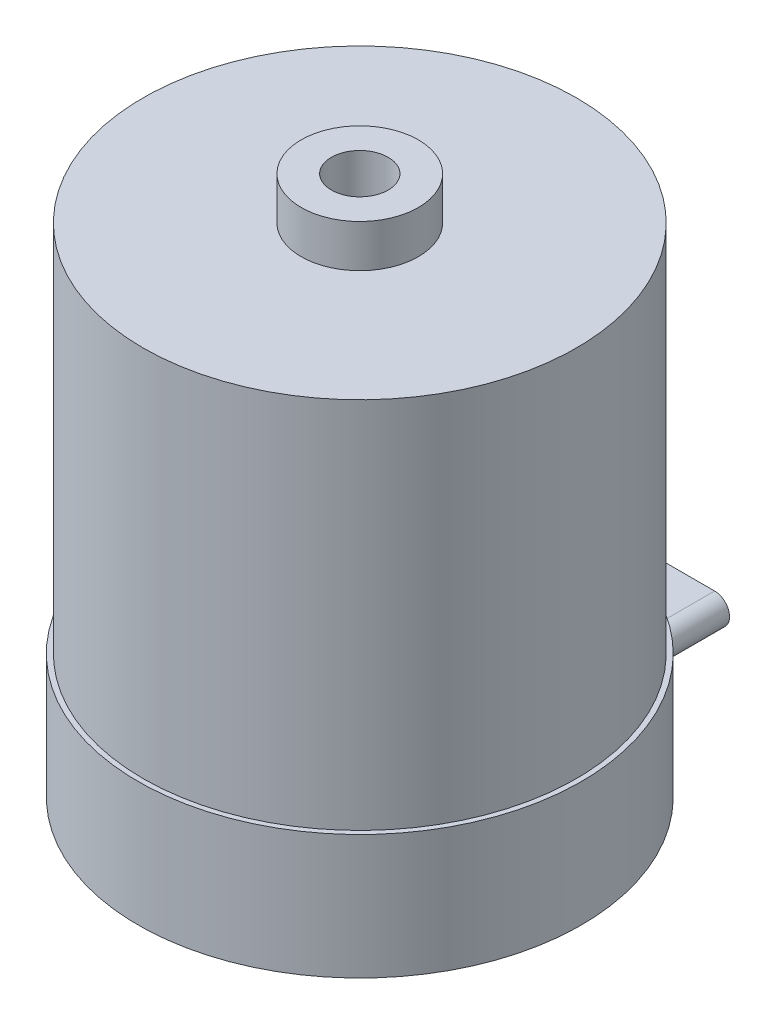
ISO-10303-21;
HEADER;
FILE_DESCRIPTION(('STEP AP214'),'2;1');
FILE_NAME('part.step','',(''),(''),'','','');
FILE_SCHEMA(('AUTOMOTIVE_DESIGN { 1 0 10303 214 1 1 1 1 }'));
ENDSEC;
DATA;
#1=APPLICATION_CONTEXT('core data for automotive mechanical design processes');
#2=APPLICATION_PROTOCOL_DEFINITION('international standard','automotive_design',2000,#1);
#3=PRODUCT_CONTEXT('',#1,'mechanical');
#4=PRODUCT('Part','Part','',(#3));
#5=PRODUCT_RELATED_PRODUCT_CATEGORY('part','',(#4));
#6=PRODUCT_DEFINITION_FORMATION('','',#4);
#7=PRODUCT_DEFINITION_CONTEXT('part definition',#1,'design');
#8=PRODUCT_DEFINITION('design','',#6,#7);
#9=PRODUCT_DEFINITION_SHAPE('','',#8);
#10=(LENGTH_UNIT() NAMED_UNIT(*) SI_UNIT(.MILLI.,.METRE.));
#11=(NAMED_UNIT(*) PLANE_ANGLE_UNIT() SI_UNIT($,.RADIAN.));
#12=(NAMED_UNIT(*) SI_UNIT($,.STERADIAN.) SOLID_ANGLE_UNIT());
#13=UNCERTAINTY_MEASURE_WITH_UNIT(LENGTH_MEASURE(1.E-05),#10,'distance_accuracy_value','');
#14=(GEOMETRIC_REPRESENTATION_CONTEXT(3) GLOBAL_UNCERTAINTY_ASSIGNED_CONTEXT((#13)) GLOBAL_UNIT_ASSIGNED_CONTEXT((#10,
#11,#12)) REPRESENTATION_CONTEXT('',''));
#15=CARTESIAN_POINT('',(0.,0.,0.));
#16=DIRECTION('',(0.,0.,1.));
#17=DIRECTION('',(1.,0.,0.));
#18=AXIS2_PLACEMENT_3D('',#15,#16,#17);
#19=CARTESIAN_POINT('',(0.,0.,0.));
#20=DIRECTION('',(0.,-1.,0.));
#21=DIRECTION('',(0.,0.,-1.));
#22=AXIS2_PLACEMENT_3D('',#19,#20,#21);
#23=CYLINDRICAL_SURFACE('',#22,31.2);
#24=CARTESIAN_POINT('',(0.,17.5,0.));
#25=DIRECTION('',(0.,-1.,0.));
#26=DIRECTION('',(0.,0.,-1.));
#27=AXIS2_PLACEMENT_3D('',#24,#25,#26);
#28=CIRCLE('',#27,31.2);
#29=CARTESIAN_POINT('',(0.,17.5,-31.2));
#30=VERTEX_POINT('',#29);
#31=EDGE_CURVE('E134',#30,#30,#28,.T.);
#32=ORIENTED_EDGE('',*,*,#31,.T.);
#33=EDGE_LOOP('',(#32));
#34=FACE_BOUND('',#33,.T.);
#35=CARTESIAN_POINT('',(0.,0.,0.));
#36=DIRECTION('',(0.,-1.,0.));
#37=DIRECTION('',(0.,0.,-1.));
#38=AXIS2_PLACEMENT_3D('',#35,#36,#37);
#39=CIRCLE('',#38,31.2);
#40=CARTESIAN_POINT('',(0.,0.,-31.2));
#41=VERTEX_POINT('',#40);
#42=EDGE_CURVE('E131',#41,#41,#39,.T.);
#43=ORIENTED_EDGE('',*,*,#42,.F.);
#44=EDGE_LOOP('',(#43));
#45=FACE_BOUND('',#44,.T.);
#46=CARTESIAN_POINT('',(0.,1.70000000000001,0.));
#47=DIRECTION('',(0.,1.,0.));
#48=DIRECTION('',(0.,0.,1.));
#49=AXIS2_PLACEMENT_3D('',#46,#47,#48);
#50=CIRCLE('',#49,31.2);
#51=CARTESIAN_POINT('',(-5.75,1.70000000000001,-30.6655751617347));
#52=VERTEX_POINT('',#51);
#53=CARTESIAN_POINT('',(5.75,1.70000000000001,-30.6655751617347));
#54=VERTEX_POINT('',#53);
#55=EDGE_CURVE('E46',#52,#54,#50,.F.);
#56=ORIENTED_EDGE('',*,*,#55,.T.);
#57=CARTESIAN_POINT('',(7.85,3.80000000000001,-30.196316000466));
#58=CARTESIAN_POINT('',(7.84999448567099,3.91536173694016,-30.1963180338355));
#59=CARTESIAN_POINT('',(7.84045705514602,4.03080569584893,-30.1988018225664));
#60=CARTESIAN_POINT('',(7.80260075470967,4.25844900335472,-30.2086045321478));
#61=CARTESIAN_POINT('',(7.77425978636606,4.37064437201333,-30.2159291420244));
#62=CARTESIAN_POINT('',(7.69977962837956,4.58840336895946,-30.2349939627344));
#63=CARTESIAN_POINT('',(7.65366296014359,4.69397519311462,-30.2467285857132));
#64=CARTESIAN_POINT('',(7.54510346408682,4.89578030384347,-30.2739910001233));
#65=CARTESIAN_POINT('',(7.48266312870166,4.99201501301372,-30.2895182124464));
#66=CARTESIAN_POINT('',(7.34217536677713,5.17419860983827,-30.3238810028875));
#67=CARTESIAN_POINT('',(7.26389187741454,5.25995599132187,-30.3427660220163));
#68=CARTESIAN_POINT('',(7.09461055366295,5.41721216353872,-30.3827920893837));
#69=CARTESIAN_POINT('',(7.00361055829085,5.48870852579844,-30.4039335209219));
#70=CARTESIAN_POINT('',(6.80861687420779,5.61751663663373,-30.448201858506));
#71=CARTESIAN_POINT('',(6.70432723911564,5.6743671237312,-30.4713681325078));
#72=CARTESIAN_POINT('',(6.48776637157115,5.76969572869092,-30.5182102081133));
#73=CARTESIAN_POINT('',(6.3754942917679,5.80817189273031,-30.5418860636235));
#74=CARTESIAN_POINT('',(6.14414344976607,5.86617989005516,-30.5892735361144));
#75=CARTESIAN_POINT('',(6.0249839120328,5.88539490606039,-30.6129795254055));
#76=CARTESIAN_POINT('',(5.78491144916794,5.90315673683179,-30.659252126115));
#77=CARTESIAN_POINT('',(5.66399852801267,5.90170359846171,-30.6818187401168));
#78=CARTESIAN_POINT('',(5.42418977674542,5.87805850289925,-30.725119631691));
#79=CARTESIAN_POINT('',(5.30528967781312,5.85591813480076,-30.7458583269266));
#80=CARTESIAN_POINT('',(5.07270599755781,5.79143980538671,-30.785086780092));
#81=CARTESIAN_POINT('',(4.95902204839848,5.74910327068646,-30.803576696755));
#82=CARTESIAN_POINT('',(4.74183165765481,5.64603511807777,-30.8377522899945));
#83=CARTESIAN_POINT('',(4.63820619717257,5.58556602456791,-30.8534732153294));
#84=CARTESIAN_POINT('',(4.44251472246486,5.44766696079992,-30.882257991054));
#85=CARTESIAN_POINT('',(4.35044781448615,5.370238303195,-30.895322046932));
#86=CARTESIAN_POINT('',(4.18189633791714,5.20180166203175,-30.9185849979683));
#87=CARTESIAN_POINT('',(4.1052111971908,5.11099952776402,-30.928821534101));
#88=CARTESIAN_POINT('',(3.9681434569102,4.91760123679714,-30.9467062991593));
#89=CARTESIAN_POINT('',(3.90776005340582,4.81500566206909,-30.9543546557303));
#90=CARTESIAN_POINT('',(3.80557366063833,4.60190365890878,-30.967083336165));
#91=CARTESIAN_POINT('',(3.76361353374799,4.49147385269025,-30.972185431127));
#92=CARTESIAN_POINT('',(3.69876250995189,4.26506961279569,-30.97999728912));
#93=CARTESIAN_POINT('',(3.67587116041637,4.14909531079675,-30.9827071089357));
#94=CARTESIAN_POINT('',(3.64988901256904,3.91536357715394,-30.9857787356151));
#95=CARTESIAN_POINT('',(3.64672388373901,3.79761451729509,-30.9861493568973));
#96=CARTESIAN_POINT('',(3.66008913640882,3.56325591112079,-30.9845734362905));
#97=CARTESIAN_POINT('',(3.67661932423248,3.44664635361128,-30.9826269171875));
#98=CARTESIAN_POINT('',(3.72886425587058,3.21797388602611,-30.9763822175439));
#99=CARTESIAN_POINT('',(3.76456337416923,3.1059073526222,-30.9720859523414));
#100=CARTESIAN_POINT('',(3.85407986974006,2.88939026626509,-30.9610737857281));
#101=CARTESIAN_POINT('',(3.907897198427,2.78493969289009,-30.9543578908057));
#102=CARTESIAN_POINT('',(4.03214871327865,2.58644483624029,-30.9384177044427));
#103=CARTESIAN_POINT('',(4.10260662660912,2.49241569639485,-30.9291898283718));
#104=CARTESIAN_POINT('',(4.25801439415385,2.3175485287904,-30.9081776459965));
#105=CARTESIAN_POINT('',(4.34296442100071,2.23671065819054,-30.8963933092387));
#106=CARTESIAN_POINT('',(4.52530271953543,2.09006731028194,-30.8702144813501));
#107=CARTESIAN_POINT('',(4.62274868880571,2.02433578467045,-30.8558077434616));
#108=CARTESIAN_POINT('',(4.82691310032025,1.91013380061104,-30.824528605131));
#109=CARTESIAN_POINT('',(4.93363192581169,1.86166405601508,-30.8076561027592));
#110=CARTESIAN_POINT('',(5.15439459205106,1.78279145016711,-30.771493956157));
#111=CARTESIAN_POINT('',(5.26850107226489,1.75257432921548,-30.7521818032359));
#112=CARTESIAN_POINT('',(5.4998297392923,1.71164760622557,-30.7116535109819));
#113=CARTESIAN_POINT('',(5.61705218211438,1.70093961212095,-30.6904372148616));
#114=CARTESIAN_POINT('',(5.85309745810511,1.69916611984691,-30.6463027552087));
#115=CARTESIAN_POINT('',(5.97191866608608,1.70838972569792,-30.6233642646505));
#116=CARTESIAN_POINT('',(6.2061671661192,1.74670984066246,-30.5767519563617));
#117=CARTESIAN_POINT('',(6.32159414578783,1.7758081729877,-30.5530780713598));
#118=CARTESIAN_POINT('',(6.54731732005256,1.85353903658137,-30.5055095302243));
#119=CARTESIAN_POINT('',(6.65753105894077,1.90241186796311,-30.4816158267315));
#120=CARTESIAN_POINT('',(6.86815888505296,2.01837894379973,-30.4348492015636));
#121=CARTESIAN_POINT('',(6.96857299693946,2.0854731423957,-30.4119762773195));
#122=CARTESIAN_POINT('',(7.15661724235671,2.23605522889835,-30.3682754553209));
#123=CARTESIAN_POINT('',(7.24425904270944,2.31952799020775,-30.3474456970036));
#124=CARTESIAN_POINT('',(7.4042172388432,2.50070635366892,-30.3088164911236));
#125=CARTESIAN_POINT('',(7.47653146443507,2.59841396799419,-30.2910174727451));
#126=CARTESIAN_POINT('',(7.60221095766867,2.80326666350593,-30.2597176840339));
#127=CARTESIAN_POINT('',(7.65592006845196,2.9101890506906,-30.2461394557056));
#128=CARTESIAN_POINT('',(7.74446528875276,3.13192964509071,-30.2235895908274));
#129=CARTESIAN_POINT('',(7.77932829058574,3.246736336612,-30.2146113912613));
#130=CARTESIAN_POINT('',(7.81939164445559,3.43531736623654,-30.2042603280688));
#131=CARTESIAN_POINT('',(7.83085237751968,3.50773452320987,-30.2012882843468));
#132=CARTESIAN_POINT('',(7.84615823177772,3.65342339830405,-30.1973154940548));
#133=CARTESIAN_POINT('',(7.85000350399839,3.72669509944893,-30.1963147083916));
#134=CARTESIAN_POINT('',(7.85,3.80000000000001,-30.196316000466));
#135=B_SPLINE_CURVE_WITH_KNOTS('',3,(#57,#58,#59,#60,#61,#62,#63,#64,#65,#66,#67,#68,#69,#70,
#71,#72,#73,#74,#75,#76,#77,#78,#79,#80,#81,#82,#83,#84,#85,#86,#87,#88,#89,#90,#91,#92,#93,#94,
#95,#96,#97,#98,#99,#100,#101,#102,#103,#104,#105,#106,#107,#108,#109,#110,#111,#112,#113,#114,
#115,#116,#117,#118,#119,#120,#121,#122,#123,#124,#125,#126,#127,#128,#129,#130,#131,#132,#133,
#134),.UNSPECIFIED.,.T.,.F.,(4,2,2,2,2,2,2,2,2,2,2,2,2,2,2,2,2,2,2,2,2,2,2,2,2,2,2,2,2,2,2,2,2,
2,2,2,2,2,4),(0.,0.345812604516335,0.692032339057707,1.03781485533047,1.38354460540801,
1.73486537460997,2.08624591837429,2.44762015614668,2.80903281188506,3.17629715637301,
3.54356066811214,3.90991074834488,4.27623495419899,4.63749247062641,4.99872203595947,
5.35488148157523,5.71102335932368,6.06406561536621,6.41709949111361,6.76880228899005,
7.12050162838481,7.47191471500951,7.82332685930335,8.17524312627262,8.52716358562311,
8.88077178731507,9.2343946105926,9.59155783220817,9.948750489728,10.3111588950779,
10.6736005504962,11.0405856248631,11.407569775623,11.7742165761485,12.14091525456,
12.5004215457531,12.8594134788147,13.0791593147986,13.298900792829),.UNSPECIFIED.);
#136=CARTESIAN_POINT('',(5.75,5.90000000000001,-30.6655751617347));
#137=VERTEX_POINT('',#136);
#138=EDGE_CURVE('E11',#54,#137,#135,.T.);
#139=ORIENTED_EDGE('',*,*,#138,.T.);
#140=CARTESIAN_POINT('',(0.,5.90000000000001,0.));
#141=DIRECTION('',(0.,-1.,0.));
#142=DIRECTION('',(0.,0.,-1.));
#143=AXIS2_PLACEMENT_3D('',#140,#141,#142);
#144=CIRCLE('',#143,31.2);
#145=CARTESIAN_POINT('',(-5.75,5.90000000000001,-30.6655751617347));
#146=VERTEX_POINT('',#145);
#147=EDGE_CURVE('E149',#137,#146,#144,.F.);
#148=ORIENTED_EDGE('',*,*,#147,.T.);
#149=CARTESIAN_POINT('',(-3.65,3.80000000000001,-30.9857628597393));
#150=CARTESIAN_POINT('',(-3.65000518949174,3.91726017505812,-30.9857628413295));
#151=CARTESIAN_POINT('',(-3.65985506936407,4.034602285374,-30.9846068929721));
#152=CARTESIAN_POINT('',(-3.69899858939728,4.26604529547181,-30.9799577623603));
#153=CARTESIAN_POINT('',(-3.72831474626438,4.38014228204068,-30.9764618734515));
#154=CARTESIAN_POINT('',(-3.8055168836236,4.60170737347846,-30.9670719374449));
#155=CARTESIAN_POINT('',(-3.85339290305004,4.70917899837475,-30.9611791766634));
#156=CARTESIAN_POINT('',(-3.96628465706012,4.91448765848241,-30.9469191858784));
#157=CARTESIAN_POINT('',(-4.03129627141931,5.01232700200217,-30.938552550655));
#158=CARTESIAN_POINT('',(-4.17668015868915,5.19584877055479,-30.9192612070236));
#159=CARTESIAN_POINT('',(-4.25708112199871,5.28150795986229,-30.9083317119658));
#160=CARTESIAN_POINT('',(-4.4307960040096,5.43810178203847,-30.8839072105468));
#161=CARTESIAN_POINT('',(-4.52411064458767,5.50903559120135,-30.8704120607491));
#162=CARTESIAN_POINT('',(-4.721556602517,5.63468905693462,-30.840831949992));
#163=CARTESIAN_POINT('',(-4.82575270580956,5.68930313729561,-30.8247311223569));
#164=CARTESIAN_POINT('',(-5.0414504513543,5.78031886883586,-30.7901883522085));
#165=CARTESIAN_POINT('',(-5.1529524875179,5.81671953709362,-30.771746283413));
#166=CARTESIAN_POINT('',(-5.38146302838998,5.87077951568477,-30.7326120286708));
#167=CARTESIAN_POINT('',(-5.49852112433652,5.8882116501226,-30.711895770429));
#168=CARTESIAN_POINT('',(-5.73361381409757,5.90323777811276,-30.6688760129673));
#169=CARTESIAN_POINT('',(-5.85164849194836,5.90083004630019,-30.646572375869));
#170=CARTESIAN_POINT('',(-6.08722738959134,5.87617737983721,-30.60065813994));
#171=CARTESIAN_POINT('',(-6.20473774682522,5.85363568448239,-30.577032963254));
#172=CARTESIAN_POINT('',(-6.43420863124702,5.78898736847904,-30.5295708898073));
#173=CARTESIAN_POINT('',(-6.54616869771029,5.74687912662861,-30.5057339756636));
#174=CARTESIAN_POINT('',(-6.76246542252823,5.64374665843538,-30.4585199695313));
#175=CARTESIAN_POINT('',(-6.86672088466987,5.5825490072551,-30.4351492728353));
#176=CARTESIAN_POINT('',(-7.06344959612681,5.44298327755614,-30.3900950783371));
#177=CARTESIAN_POINT('',(-7.15592292929556,5.3646153212494,-30.3684115685278));
#178=CARTESIAN_POINT('',(-7.32570504770469,5.19340688526948,-30.3279017567364));
#179=CARTESIAN_POINT('',(-7.40311805616859,5.10067448124677,-30.3090560377859));
#180=CARTESIAN_POINT('',(-7.54115567981103,4.9028600896495,-30.27500690384));
#181=CARTESIAN_POINT('',(-7.60178281117327,4.79777995635274,-30.2598029429954));
#182=CARTESIAN_POINT('',(-7.70291978238377,4.5810531879501,-30.2342139475761));
#183=CARTESIAN_POINT('',(-7.74389661014344,4.46963773977319,-30.2237174796867));
#184=CARTESIAN_POINT('',(-7.80654793168506,4.24117233224939,-30.2075962126928));
#185=CARTESIAN_POINT('',(-7.82822605111029,4.12412343561425,-30.2019704985265));
#186=CARTESIAN_POINT('',(-7.85119265856595,3.89117127789702,-30.1960081850176));
#187=CARTESIAN_POINT('',(-7.85302537455721,3.77532500447955,-30.195530413542));
#188=CARTESIAN_POINT('',(-7.83765233358795,3.54499598885895,-30.1995242937609));
#189=CARTESIAN_POINT('',(-7.82044794540752,3.43051314922221,-30.2039955896141));
#190=CARTESIAN_POINT('',(-7.76782560394326,3.20718732661724,-30.2175711560321));
#191=CARTESIAN_POINT('',(-7.73257017051161,3.09830340095166,-30.2266340790688));
#192=CARTESIAN_POINT('',(-7.645075421259,2.88804711263119,-30.2488817605759));
#193=CARTESIAN_POINT('',(-7.59283495618144,2.78667525883499,-30.2620667979582));
#194=CARTESIAN_POINT('',(-7.47197946017543,2.5924912044058,-30.2921350970667));
#195=CARTESIAN_POINT('',(-7.40311159638771,2.49984530372517,-30.3090750937677));
#196=CARTESIAN_POINT('',(-7.25149240078806,2.3273449980673,-30.3457069245464));
#197=CARTESIAN_POINT('',(-7.16873905459701,2.24749245232366,-30.3653991578241));
#198=CARTESIAN_POINT('',(-6.98908128922251,2.10043103438709,-30.4072602288551));
#199=CARTESIAN_POINT('',(-6.8918393586395,2.0336499646173,-30.4294838587832));
#200=CARTESIAN_POINT('',(-6.68775648488291,1.91733905586522,-30.474987050394));
#201=CARTESIAN_POINT('',(-6.58091433030093,1.86781139786853,-30.4982667451525));
#202=CARTESIAN_POINT('',(-6.35813641306215,1.78641376012754,-30.5454960074716));
#203=CARTESIAN_POINT('',(-6.24205519675526,1.7549433745828,-30.5694492649659));
#204=CARTESIAN_POINT('',(-6.00609165145505,1.71222753463535,-30.6166839580516));
#205=CARTESIAN_POINT('',(-5.88620919015455,1.70098278499979,-30.6399653702046));
#206=CARTESIAN_POINT('',(-5.64565575804924,1.6991380807993,-30.6852014940704));
#207=CARTESIAN_POINT('',(-5.52498350188116,1.70859980638469,-30.7071520413068));
#208=CARTESIAN_POINT('',(-5.28671815199543,1.74818340142675,-30.7490690217212));
#209=CARTESIAN_POINT('',(-5.16912488775579,1.77830412421515,-30.7690355649501));
#210=CARTESIAN_POINT('',(-4.94186350021669,1.85802980725293,-30.8063484396295));
#211=CARTESIAN_POINT('',(-4.83211932108119,1.90740490094615,-30.8237224570727));
#212=CARTESIAN_POINT('',(-4.62238678510591,2.02435918361674,-30.8558715290639));
#213=CARTESIAN_POINT('',(-4.52239727320891,2.09193621371695,-30.8706468914872));
#214=CARTESIAN_POINT('',(-4.33664935546115,2.24227621181338,-30.8972840617516));
#215=CARTESIAN_POINT('',(-4.25069984097951,2.32479597180143,-30.909186279178));
#216=CARTESIAN_POINT('',(-4.09382374670733,2.503387185357,-30.9303554890465));
#217=CARTESIAN_POINT('',(-4.02289991154391,2.59946110943103,-30.9396220001498));
#218=CARTESIAN_POINT('',(-3.89889203251165,2.80135077282014,-30.9554926092961));
#219=CARTESIAN_POINT('',(-3.84563608923547,2.90705906459501,-30.9621224944043));
#220=CARTESIAN_POINT('',(-3.7576347811549,3.12593674000036,-30.9729263240446));
#221=CARTESIAN_POINT('',(-3.72286727701098,3.23909701670151,-30.9771032066008));
#222=CARTESIAN_POINT('',(-3.68194845607839,3.42746711324165,-30.9819865983437));
#223=CARTESIAN_POINT('',(-3.66998372443978,3.50144744300406,-30.9834033816469));
#224=CARTESIAN_POINT('',(-3.65400784924822,3.65027404605433,-30.9852915170586));
#225=CARTESIAN_POINT('',(-3.64999668610852,3.72512031720923,-30.9857628714954));
#226=CARTESIAN_POINT('',(-3.65,3.80000000000001,-30.9857628597393));
#227=B_SPLINE_CURVE_WITH_KNOTS('',3,(#149,#150,#151,#152,#153,#154,#155,#156,#157,#158,#159,
#160,#161,#162,#163,#164,#165,#166,#167,#168,#169,#170,#171,#172,#173,#174,#175,#176,#177,#178,
#179,#180,#181,#182,#183,#184,#185,#186,#187,#188,#189,#190,#191,#192,#193,#194,#195,#196,#197,
#198,#199,#200,#201,#202,#203,#204,#205,#206,#207,#208,#209,#210,#211,#212,#213,#214,#215,#216,
#217,#218,#219,#220,#221,#222,#223,#224,#225,#226),.UNSPECIFIED.,.T.,.F.,(4,2,2,2,2,2,2,2,2,2,2,
2,2,2,2,2,2,2,2,2,2,2,2,2,2,2,2,2,2,2,2,2,2,2,2,2,2,2,4),(0.,0.351507028935626,
0.703421357128441,1.05514707403931,1.40678829613248,1.75909158396814,2.11141457357805,
2.46596979328996,2.82054414518714,3.1793198293238,3.53812671455325,3.9023110630163,
4.26652559164762,4.63415037997652,5.00177255177207,5.3667523004482,5.73167730942241,
6.08743757949464,6.44313099886447,6.78904456907343,7.13493326948932,7.47776118532204,
7.82061230271677,8.16904738821365,8.51753306526655,8.87600318906776,9.23451861027051,
9.6006888243354,9.96687179744218,10.3341470354412,10.7014018896442,11.0644002931228,
11.4273556613925,11.7848621847183,12.1424339548582,12.4964170736696,12.8499753485394,
13.0744403012061,13.2989047010962),.UNSPECIFIED.);
#228=EDGE_CURVE('E152',#146,#52,#227,.T.);
#229=ORIENTED_EDGE('',*,*,#228,.T.);
#230=EDGE_LOOP('',(#56,#139,#148,#229));
#231=FACE_BOUND('',#230,.T.);
#232=ADVANCED_FACE('F33',(#34,#45,#231),#23,.T.);
#233=CARTESIAN_POINT('',(4.,76.,0.));
#234=DIRECTION('',(0.,1.,0.));
#235=DIRECTION('',(0.,0.,1.));
#236=AXIS2_PLACEMENT_3D('',#233,#234,#235);
#237=PLANE('',#236);
#238=CARTESIAN_POINT('',(0.,76.,0.));
#239=DIRECTION('',(0.,-1.,0.));
#240=DIRECTION('',(0.,0.,-1.));
#241=AXIS2_PLACEMENT_3D('',#238,#239,#240);
#242=CIRCLE('',#241,4.);
#243=CARTESIAN_POINT('',(0.,76.,-4.));
#244=VERTEX_POINT('',#243);
#245=EDGE_CURVE('E123',#244,#244,#242,.T.);
#246=ORIENTED_EDGE('',*,*,#245,.T.);
#247=EDGE_LOOP('',(#246));
#248=FACE_BOUND('',#247,.T.);
#249=CARTESIAN_POINT('',(0.,76.,0.));
#250=DIRECTION('',(0.,-1.,0.));
#251=DIRECTION('',(0.,0.,-1.));
#252=AXIS2_PLACEMENT_3D('',#249,#250,#251);
#253=CIRCLE('',#252,8.25);
#254=CARTESIAN_POINT('',(0.,76.,-8.25));
#255=VERTEX_POINT('',#254);
#256=EDGE_CURVE('E146',#255,#255,#253,.T.);
#257=ORIENTED_EDGE('',*,*,#256,.F.);
#258=EDGE_LOOP('',(#257));
#259=FACE_BOUND('',#258,.T.);
#260=ADVANCED_FACE('F35',(#248,#259),#237,.T.);
#261=CARTESIAN_POINT('',(0.,0.,0.));
#262=DIRECTION('',(0.,-1.,0.));
#263=DIRECTION('',(0.,0.,-1.));
#264=AXIS2_PLACEMENT_3D('',#261,#262,#263);
#265=CYLINDRICAL_SURFACE('',#264,8.25);
#266=ORIENTED_EDGE('',*,*,#256,.T.);
#267=EDGE_LOOP('',(#266));
#268=FACE_BOUND('',#267,.T.);
#269=CARTESIAN_POINT('',(0.,70.,0.));
#270=DIRECTION('',(0.,-1.,0.));
#271=DIRECTION('',(0.,0.,-1.));
#272=AXIS2_PLACEMENT_3D('',#269,#270,#271);
#273=CIRCLE('',#272,8.25);
#274=CARTESIAN_POINT('',(0.,70.,-8.25));
#275=VERTEX_POINT('',#274);
#276=EDGE_CURVE('E143',#275,#275,#273,.T.);
#277=ORIENTED_EDGE('',*,*,#276,.F.);
#278=EDGE_LOOP('',(#277));
#279=FACE_BOUND('',#278,.T.);
#280=ADVANCED_FACE('F224',(#268,#279),#265,.T.);
#281=CARTESIAN_POINT('',(8.25,70.,0.));
#282=DIRECTION('',(0.,1.,0.));
#283=DIRECTION('',(0.,0.,1.));
#284=AXIS2_PLACEMENT_3D('',#281,#282,#283);
#285=PLANE('',#284);
#286=ORIENTED_EDGE('',*,*,#276,.T.);
#287=EDGE_LOOP('',(#286));
#288=FACE_BOUND('',#287,.T.);
#289=CARTESIAN_POINT('',(0.,70.,0.));
#290=DIRECTION('',(0.,-1.,0.));
#291=DIRECTION('',(0.,0.,-1.));
#292=AXIS2_PLACEMENT_3D('',#289,#290,#291);
#293=CIRCLE('',#292,30.5);
#294=CARTESIAN_POINT('',(0.,70.,-30.5));
#295=VERTEX_POINT('',#294);
#296=EDGE_CURVE('E140',#295,#295,#293,.T.);
#297=ORIENTED_EDGE('',*,*,#296,.F.);
#298=EDGE_LOOP('',(#297));
#299=FACE_BOUND('',#298,.T.);
#300=ADVANCED_FACE('F339',(#288,#299),#285,.T.);
#301=CARTESIAN_POINT('',(0.,0.,0.));
#302=DIRECTION('',(0.,-1.,0.));
#303=DIRECTION('',(0.,0.,-1.));
#304=AXIS2_PLACEMENT_3D('',#301,#302,#303);
#305=CYLINDRICAL_SURFACE('',#304,30.5);
#306=ORIENTED_EDGE('',*,*,#296,.T.);
#307=EDGE_LOOP('',(#306));
#308=FACE_BOUND('',#307,.T.);
#309=CARTESIAN_POINT('',(0.,17.5,0.));
#310=DIRECTION('',(0.,-1.,0.));
#311=DIRECTION('',(0.,0.,-1.));
#312=AXIS2_PLACEMENT_3D('',#309,#310,#311);
#313=CIRCLE('',#312,30.5);
#314=CARTESIAN_POINT('',(0.,17.5,-30.5));
#315=VERTEX_POINT('',#314);
#316=EDGE_CURVE('E137',#315,#315,#313,.T.);
#317=ORIENTED_EDGE('',*,*,#316,.F.);
#318=EDGE_LOOP('',(#317));
#319=FACE_BOUND('',#318,.T.);
#320=ADVANCED_FACE('F215',(#308,#319),#305,.T.);
#321=CARTESIAN_POINT('',(30.5,17.5,0.));
#322=DIRECTION('',(0.,1.,0.));
#323=DIRECTION('',(0.,0.,1.));
#324=AXIS2_PLACEMENT_3D('',#321,#322,#323);
#325=PLANE('',#324);
#326=ORIENTED_EDGE('',*,*,#316,.T.);
#327=EDGE_LOOP('',(#326));
#328=FACE_BOUND('',#327,.T.);
#329=ORIENTED_EDGE('',*,*,#31,.F.);
#330=EDGE_LOOP('',(#329));
#331=FACE_BOUND('',#330,.T.);
#332=ADVANCED_FACE('F210',(#328,#331),#325,.T.);
#333=CARTESIAN_POINT('',(31.2,0.,0.));
#334=DIRECTION('',(0.,-1.,0.));
#335=DIRECTION('',(0.,0.,-1.));
#336=AXIS2_PLACEMENT_3D('',#333,#334,#335);
#337=PLANE('',#336);
#338=CARTESIAN_POINT('',(15.556349186104,0.,15.556349186104));
#339=DIRECTION('',(0.,-1.,0.));
#340=DIRECTION('',(0.,0.,-1.));
#341=AXIS2_PLACEMENT_3D('',#338,#339,#340);
#342=CIRCLE('',#341,1.65);
#343=CARTESIAN_POINT('',(15.556349186104,0.,13.906349186104));
#344=VERTEX_POINT('',#343);
#345=EDGE_CURVE('E97',#344,#344,#342,.T.);
#346=ORIENTED_EDGE('',*,*,#345,.F.);
#347=EDGE_LOOP('',(#346));
#348=FACE_BOUND('',#347,.T.);
#349=CARTESIAN_POINT('',(-15.5563491861041,0.,15.556349186104));
#350=DIRECTION('',(0.,-1.,0.));
#351=DIRECTION('',(0.,0.,-1.));
#352=AXIS2_PLACEMENT_3D('',#349,#350,#351);
#353=CIRCLE('',#352,1.65);
#354=CARTESIAN_POINT('',(-15.5563491861041,0.,13.906349186104));
#355=VERTEX_POINT('',#354);
#356=EDGE_CURVE('E115',#355,#355,#353,.T.);
#357=ORIENTED_EDGE('',*,*,#356,.F.);
#358=EDGE_LOOP('',(#357));
#359=FACE_BOUND('',#358,.T.);
#360=CARTESIAN_POINT('',(-15.556349186104,0.,-15.5563491861041));
#361=DIRECTION('',(0.,-1.,0.));
#362=DIRECTION('',(0.,0.,-1.));
#363=AXIS2_PLACEMENT_3D('',#360,#361,#362);
#364=CIRCLE('',#363,1.65);
#365=CARTESIAN_POINT('',(-15.556349186104,0.,-17.2063491861041));
#366=VERTEX_POINT('',#365);
#367=EDGE_CURVE('E109',#366,#366,#364,.T.);
#368=ORIENTED_EDGE('',*,*,#367,.F.);
#369=EDGE_LOOP('',(#368));
#370=FACE_BOUND('',#369,.T.);
#371=CARTESIAN_POINT('',(15.5563491861041,0.,-15.556349186104));
#372=DIRECTION('',(0.,-1.,0.));
#373=DIRECTION('',(0.,0.,-1.));
#374=AXIS2_PLACEMENT_3D('',#371,#372,#373);
#375=CIRCLE('',#374,1.65);
#376=CARTESIAN_POINT('',(15.5563491861041,0.,-17.206349186104));
#377=VERTEX_POINT('',#376);
#378=EDGE_CURVE('E108',#377,#377,#375,.T.);
#379=ORIENTED_EDGE('',*,*,#378,.F.);
#380=EDGE_LOOP('',(#379));
#381=FACE_BOUND('',#380,.T.);
#382=ORIENTED_EDGE('',*,*,#42,.T.);
#383=EDGE_LOOP('',(#382));
#384=FACE_BOUND('',#383,.T.);
#385=CARTESIAN_POINT('',(0.,0.,0.));
#386=DIRECTION('',(0.,-1.,0.));
#387=DIRECTION('',(0.,0.,-1.));
#388=AXIS2_PLACEMENT_3D('',#385,#386,#387);
#389=CIRCLE('',#388,4.);
#390=CARTESIAN_POINT('',(0.,0.,-4.));
#391=VERTEX_POINT('',#390);
#392=EDGE_CURVE('E128',#391,#391,#389,.T.);
#393=ORIENTED_EDGE('',*,*,#392,.F.);
#394=EDGE_LOOP('',(#393));
#395=FACE_BOUND('',#394,.T.);
#396=ADVANCED_FACE('F207',(#348,#359,#370,#381,#384,#395),#337,.T.);
#397=CARTESIAN_POINT('',(0.,0.,0.));
#398=DIRECTION('',(0.,-1.,0.));
#399=DIRECTION('',(0.,0.,-1.));
#400=AXIS2_PLACEMENT_3D('',#397,#398,#399);
#401=CYLINDRICAL_SURFACE('',#400,4.);
#402=ORIENTED_EDGE('',*,*,#392,.T.);
#403=EDGE_LOOP('',(#402));
#404=FACE_BOUND('',#403,.T.);
#405=ORIENTED_EDGE('',*,*,#245,.F.);
#406=EDGE_LOOP('',(#405));
#407=FACE_BOUND('',#406,.T.);
#408=ADVANCED_FACE('F204',(#404,#407),#401,.F.);
#409=CARTESIAN_POINT('',(15.5563491861041,5.,-15.556349186104));
#410=DIRECTION('',(0.,-1.,0.));
#411=DIRECTION('',(0.,0.,-1.));
#412=AXIS2_PLACEMENT_3D('',#409,#410,#411);
#413=CYLINDRICAL_SURFACE('',#412,1.65);
#414=CARTESIAN_POINT('',(15.5563491861041,5.,-15.556349186104));
#415=DIRECTION('',(0.,-1.,0.));
#416=DIRECTION('',(0.,0.,-1.));
#417=AXIS2_PLACEMENT_3D('',#414,#415,#416);
#418=CIRCLE('',#417,1.65);
#419=CARTESIAN_POINT('',(15.5563491861041,5.,-17.206349186104));
#420=VERTEX_POINT('',#419);
#421=EDGE_CURVE('E120',#420,#420,#418,.T.);
#422=ORIENTED_EDGE('',*,*,#421,.F.);
#423=EDGE_LOOP('',(#422));
#424=FACE_BOUND('',#423,.T.);
#425=ORIENTED_EDGE('',*,*,#378,.T.);
#426=EDGE_LOOP('',(#425));
#427=FACE_BOUND('',#426,.T.);
#428=ADVANCED_FACE('F200',(#424,#427),#413,.F.);
#429=CARTESIAN_POINT('',(15.5563491861041,5.,-15.556349186104));
#430=DIRECTION('',(0.,-1.,0.));
#431=DIRECTION('',(0.,0.,-1.));
#432=AXIS2_PLACEMENT_3D('',#429,#430,#431);
#433=PLANE('',#432);
#434=ORIENTED_EDGE('',*,*,#421,.T.);
#435=EDGE_LOOP('',(#434));
#436=FACE_BOUND('',#435,.T.);
#437=ADVANCED_FACE('F182',(#436),#433,.T.);
#438=CARTESIAN_POINT('',(-15.556349186104,5.,-15.5563491861041));
#439=DIRECTION('',(0.,-1.,0.));
#440=DIRECTION('',(0.,0.,-1.));
#441=AXIS2_PLACEMENT_3D('',#438,#439,#440);
#442=CYLINDRICAL_SURFACE('',#441,1.65);
#443=CARTESIAN_POINT('',(-15.556349186104,5.,-15.5563491861041));
#444=DIRECTION('',(0.,-1.,0.));
#445=DIRECTION('',(0.,0.,-1.));
#446=AXIS2_PLACEMENT_3D('',#443,#444,#445);
#447=CIRCLE('',#446,1.65);
#448=CARTESIAN_POINT('',(-15.556349186104,5.,-17.2063491861041));
#449=VERTEX_POINT('',#448);
#450=EDGE_CURVE('E105',#449,#449,#447,.T.);
#451=ORIENTED_EDGE('',*,*,#450,.F.);
#452=EDGE_LOOP('',(#451));
#453=FACE_BOUND('',#452,.T.);
#454=ORIENTED_EDGE('',*,*,#367,.T.);
#455=EDGE_LOOP('',(#454));
#456=FACE_BOUND('',#455,.T.);
#457=ADVANCED_FACE('F178',(#453,#456),#442,.F.);
#458=CARTESIAN_POINT('',(-15.556349186104,5.,-15.5563491861041));
#459=DIRECTION('',(0.,-1.,0.));
#460=DIRECTION('',(0.,0.,-1.));
#461=AXIS2_PLACEMENT_3D('',#458,#459,#460);
#462=PLANE('',#461);
#463=ORIENTED_EDGE('',*,*,#450,.T.);
#464=EDGE_LOOP('',(#463));
#465=FACE_BOUND('',#464,.T.);
#466=ADVANCED_FACE('F174',(#465),#462,.T.);
#467=CARTESIAN_POINT('',(-15.5563491861041,5.,15.556349186104));
#468=DIRECTION('',(0.,-1.,0.));
#469=DIRECTION('',(0.,0.,-1.));
#470=AXIS2_PLACEMENT_3D('',#467,#468,#469);
#471=CYLINDRICAL_SURFACE('',#470,1.65);
#472=CARTESIAN_POINT('',(-15.5563491861041,5.,15.556349186104));
#473=DIRECTION('',(0.,-1.,0.));
#474=DIRECTION('',(0.,0.,-1.));
#475=AXIS2_PLACEMENT_3D('',#472,#473,#474);
#476=CIRCLE('',#475,1.65);
#477=CARTESIAN_POINT('',(-15.5563491861041,5.,13.906349186104));
#478=VERTEX_POINT('',#477);
#479=EDGE_CURVE('E112',#478,#478,#476,.T.);
#480=ORIENTED_EDGE('',*,*,#479,.F.);
#481=EDGE_LOOP('',(#480));
#482=FACE_BOUND('',#481,.T.);
#483=ORIENTED_EDGE('',*,*,#356,.T.);
#484=EDGE_LOOP('',(#483));
#485=FACE_BOUND('',#484,.T.);
#486=ADVANCED_FACE('F177',(#482,#485),#471,.F.);
#487=CARTESIAN_POINT('',(-15.5563491861041,5.,15.556349186104));
#488=DIRECTION('',(0.,-1.,0.));
#489=DIRECTION('',(0.,0.,-1.));
#490=AXIS2_PLACEMENT_3D('',#487,#488,#489);
#491=PLANE('',#490);
#492=ORIENTED_EDGE('',*,*,#479,.T.);
#493=EDGE_LOOP('',(#492));
#494=FACE_BOUND('',#493,.T.);
#495=ADVANCED_FACE('F184',(#494),#491,.T.);
#496=CARTESIAN_POINT('',(15.556349186104,5.,15.556349186104));
#497=DIRECTION('',(0.,-1.,0.));
#498=DIRECTION('',(0.,0.,-1.));
#499=AXIS2_PLACEMENT_3D('',#496,#497,#498);
#500=CYLINDRICAL_SURFACE('',#499,1.65);
#501=CARTESIAN_POINT('',(15.556349186104,5.,15.556349186104));
#502=DIRECTION('',(0.,-1.,0.));
#503=DIRECTION('',(0.,0.,-1.));
#504=AXIS2_PLACEMENT_3D('',#501,#502,#503);
#505=CIRCLE('',#504,1.65);
#506=CARTESIAN_POINT('',(15.556349186104,5.,13.906349186104));
#507=VERTEX_POINT('',#506);
#508=EDGE_CURVE('E100',#507,#507,#505,.T.);
#509=ORIENTED_EDGE('',*,*,#508,.F.);
#510=EDGE_LOOP('',(#509));
#511=FACE_BOUND('',#510,.T.);
#512=ORIENTED_EDGE('',*,*,#345,.T.);
#513=EDGE_LOOP('',(#512));
#514=FACE_BOUND('',#513,.T.);
#515=ADVANCED_FACE('F187',(#511,#514),#500,.F.);
#516=CARTESIAN_POINT('',(15.556349186104,5.,15.556349186104));
#517=DIRECTION('',(0.,-1.,0.));
#518=DIRECTION('',(0.,0.,-1.));
#519=AXIS2_PLACEMENT_3D('',#516,#517,#518);
#520=PLANE('',#519);
#521=ORIENTED_EDGE('',*,*,#508,.T.);
#522=EDGE_LOOP('',(#521));
#523=FACE_BOUND('',#522,.T.);
#524=ADVANCED_FACE('F173',(#523),#520,.T.);
#525=CARTESIAN_POINT('',(5.75,3.80000000000001,-44.2));
#526=DIRECTION('',(0.,0.,1.));
#527=DIRECTION('',(1.,0.,0.));
#528=AXIS2_PLACEMENT_3D('',#525,#526,#527);
#529=CYLINDRICAL_SURFACE('',#528,2.1);
#530=ORIENTED_EDGE('',*,*,#138,.F.);
#531=DIRECTION('',(0.,0.,1.));
#532=VECTOR('',#531,1.);
#533=CARTESIAN_POINT('',(5.75,1.70000000000001,-44.2));
#534=LINE('',#533,#532);
#535=CARTESIAN_POINT('',(5.75,1.70000000000001,-44.2));
#536=VERTEX_POINT('',#535);
#537=EDGE_CURVE('E82',#536,#54,#534,.T.);
#538=ORIENTED_EDGE('',*,*,#537,.F.);
#539=CARTESIAN_POINT('',(5.75,3.80000000000001,-44.2));
#540=DIRECTION('',(0.,0.,-1.));
#541=DIRECTION('',(-1.,0.,0.));
#542=AXIS2_PLACEMENT_3D('',#539,#540,#541);
#543=CIRCLE('',#542,2.1);
#544=CARTESIAN_POINT('',(5.75,5.90000000000001,-44.2));
#545=VERTEX_POINT('',#544);
#546=EDGE_CURVE('E89',#545,#536,#543,.T.);
#547=ORIENTED_EDGE('',*,*,#546,.F.);
#548=DIRECTION('',(0.,0.,1.));
#549=VECTOR('',#548,1.);
#550=CARTESIAN_POINT('',(5.75,5.90000000000001,-44.2));
#551=LINE('',#550,#549);
#552=EDGE_CURVE('E231',#545,#137,#551,.T.);
#553=ORIENTED_EDGE('',*,*,#552,.T.);
#554=EDGE_LOOP('',(#530,#538,#547,#553));
#555=FACE_BOUND('',#554,.T.);
#556=ADVANCED_FACE('F96',(#555),#529,.T.);
#557=CARTESIAN_POINT('',(5.75,1.70000000000001,-44.2));
#558=DIRECTION('',(0.,1.,0.));
#559=DIRECTION('',(0.,0.,1.));
#560=AXIS2_PLACEMENT_3D('',#557,#558,#559);
#561=PLANE('',#560);
#562=ORIENTED_EDGE('',*,*,#55,.F.);
#563=DIRECTION('',(0.,0.,1.));
#564=VECTOR('',#563,1.);
#565=CARTESIAN_POINT('',(-5.75,1.70000000000001,-44.2));
#566=LINE('',#565,#564);
#567=CARTESIAN_POINT('',(-5.75,1.70000000000001,-44.2));
#568=VERTEX_POINT('',#567);
#569=EDGE_CURVE('E85',#568,#52,#566,.T.);
#570=ORIENTED_EDGE('',*,*,#569,.F.);
#571=DIRECTION('',(-1.,0.,0.));
#572=VECTOR('',#571,1.);
#573=CARTESIAN_POINT('',(5.75,1.70000000000001,-44.2));
#574=LINE('',#573,#572);
#575=EDGE_CURVE('E79',#536,#568,#574,.T.);
#576=ORIENTED_EDGE('',*,*,#575,.F.);
#577=ORIENTED_EDGE('',*,*,#537,.T.);
#578=EDGE_LOOP('',(#562,#570,#576,#577));
#579=FACE_BOUND('',#578,.T.);
#580=ADVANCED_FACE('F81',(#579),#561,.F.);
#581=CARTESIAN_POINT('',(-5.75,3.80000000000001,-44.2));
#582=DIRECTION('',(0.,0.,1.));
#583=DIRECTION('',(1.,0.,0.));
#584=AXIS2_PLACEMENT_3D('',#581,#582,#583);
#585=CYLINDRICAL_SURFACE('',#584,2.1);
#586=ORIENTED_EDGE('',*,*,#228,.F.);
#587=DIRECTION('',(0.,0.,1.));
#588=VECTOR('',#587,1.);
#589=CARTESIAN_POINT('',(-5.75,5.90000000000001,-44.2));
#590=LINE('',#589,#588);
#591=CARTESIAN_POINT('',(-5.75,5.90000000000001,-44.2));
#592=VERTEX_POINT('',#591);
#593=EDGE_CURVE('E53',#592,#146,#590,.T.);
#594=ORIENTED_EDGE('',*,*,#593,.F.);
#595=CARTESIAN_POINT('',(-5.75,3.80000000000001,-44.2));
#596=DIRECTION('',(0.,0.,-1.));
#597=DIRECTION('',(-1.,0.,0.));
#598=AXIS2_PLACEMENT_3D('',#595,#596,#597);
#599=CIRCLE('',#598,2.1);
#600=EDGE_CURVE('E88',#568,#592,#599,.T.);
#601=ORIENTED_EDGE('',*,*,#600,.F.);
#602=ORIENTED_EDGE('',*,*,#569,.T.);
#603=EDGE_LOOP('',(#586,#594,#601,#602));
#604=FACE_BOUND('',#603,.T.);
#605=ADVANCED_FACE('F161',(#604),#585,.T.);
#606=CARTESIAN_POINT('',(5.75,5.90000000000001,-44.2));
#607=DIRECTION('',(0.,-1.,0.));
#608=DIRECTION('',(0.,0.,-1.));
#609=AXIS2_PLACEMENT_3D('',#606,#607,#608);
#610=PLANE('',#609);
#611=ORIENTED_EDGE('',*,*,#147,.F.);
#612=ORIENTED_EDGE('',*,*,#552,.F.);
#613=DIRECTION('',(1.,0.,0.));
#614=VECTOR('',#613,1.);
#615=CARTESIAN_POINT('',(5.75,5.90000000000001,-44.2));
#616=LINE('',#615,#614);
#617=EDGE_CURVE('E93',#592,#545,#616,.T.);
#618=ORIENTED_EDGE('',*,*,#617,.F.);
#619=ORIENTED_EDGE('',*,*,#593,.T.);
#620=EDGE_LOOP('',(#611,#612,#618,#619));
#621=FACE_BOUND('',#620,.T.);
#622=ADVANCED_FACE('F166',(#621),#610,.F.);
#623=CARTESIAN_POINT('',(5.75,3.80000000000001,-44.2));
#624=DIRECTION('',(0.,0.,-1.));
#625=DIRECTION('',(-1.,0.,0.));
#626=AXIS2_PLACEMENT_3D('',#623,#624,#625);
#627=PLANE('',#626);
#628=ORIENTED_EDGE('',*,*,#546,.T.);
#629=ORIENTED_EDGE('',*,*,#575,.T.);
#630=ORIENTED_EDGE('',*,*,#600,.T.);
#631=ORIENTED_EDGE('',*,*,#617,.T.);
#632=EDGE_LOOP('',(#628,#629,#630,#631));
#633=FACE_BOUND('',#632,.T.);
#634=ADVANCED_FACE('F92',(#633),#627,.T.);
#635=CLOSED_SHELL('',(#232,#260,#280,#300,#320,#332,#396,#408,#428,#437,#457,#466,#486,#495,
#515,#524,#556,#580,#605,#622,#634));
#636=MANIFOLD_SOLID_BREP('B2',#635);
#637=ADVANCED_BREP_SHAPE_REPRESENTATION('',(#18,#636),#14);
#638=SHAPE_DEFINITION_REPRESENTATION(#9,#637);
ENDSEC;
END-ISO-10303-21;
